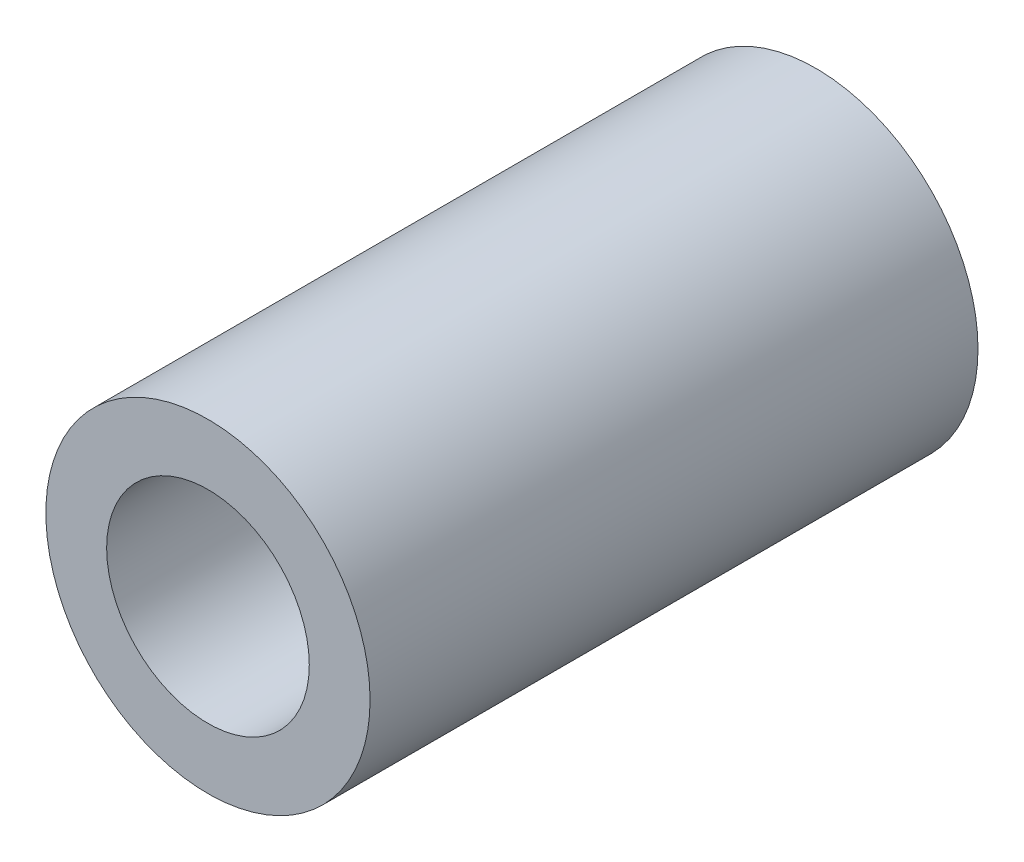
ISO-10303-21;
HEADER;
FILE_DESCRIPTION(('STEP AP214'),'2;1');
FILE_NAME('part.step','',(''),(''),'','','');
FILE_SCHEMA(('AUTOMOTIVE_DESIGN { 1 0 10303 214 1 1 1 1 }'));
ENDSEC;
DATA;
#1=APPLICATION_CONTEXT('core data for automotive mechanical design processes');
#2=APPLICATION_PROTOCOL_DEFINITION('international standard','automotive_design',2000,#1);
#3=PRODUCT_CONTEXT('',#1,'mechanical');
#4=PRODUCT('Part','Part','',(#3));
#5=PRODUCT_RELATED_PRODUCT_CATEGORY('part','',(#4));
#6=PRODUCT_DEFINITION_FORMATION('','',#4);
#7=PRODUCT_DEFINITION_CONTEXT('part definition',#1,'design');
#8=PRODUCT_DEFINITION('design','',#6,#7);
#9=PRODUCT_DEFINITION_SHAPE('','',#8);
#10=(LENGTH_UNIT() NAMED_UNIT(*) SI_UNIT(.MILLI.,.METRE.));
#11=(NAMED_UNIT(*) PLANE_ANGLE_UNIT() SI_UNIT($,.RADIAN.));
#12=(NAMED_UNIT(*) SI_UNIT($,.STERADIAN.) SOLID_ANGLE_UNIT());
#13=UNCERTAINTY_MEASURE_WITH_UNIT(LENGTH_MEASURE(1.E-05),#10,'distance_accuracy_value','');
#14=(GEOMETRIC_REPRESENTATION_CONTEXT(3) GLOBAL_UNCERTAINTY_ASSIGNED_CONTEXT((#13)) GLOBAL_UNIT_ASSIGNED_CONTEXT((#10,
#11,#12)) REPRESENTATION_CONTEXT('',''));
#15=CARTESIAN_POINT('',(0.,0.,0.));
#16=DIRECTION('',(0.,0.,1.));
#17=DIRECTION('',(1.,0.,0.));
#18=AXIS2_PLACEMENT_3D('',#15,#16,#17);
#19=CARTESIAN_POINT('',(0.,0.,6.));
#20=DIRECTION('',(0.,0.,1.));
#21=DIRECTION('',(1.,0.,0.));
#22=AXIS2_PLACEMENT_3D('',#19,#20,#21);
#23=PLANE('',#22);
#24=CARTESIAN_POINT('',(0.,0.,6.));
#25=DIRECTION('',(0.,0.,1.));
#26=DIRECTION('',(1.,0.,0.));
#27=AXIS2_PLACEMENT_3D('',#24,#25,#26);
#28=CIRCLE('',#27,1.6);
#29=CARTESIAN_POINT('',(1.6,0.,6.));
#30=VERTEX_POINT('',#29);
#31=EDGE_CURVE('E10',#30,#30,#28,.T.);
#32=ORIENTED_EDGE('',*,*,#31,.T.);
#33=EDGE_LOOP('',(#32));
#34=FACE_BOUND('',#33,.T.);
#35=CARTESIAN_POINT('',(0.,0.,6.));
#36=DIRECTION('',(0.,0.,1.));
#37=DIRECTION('',(1.,0.,0.));
#38=AXIS2_PLACEMENT_3D('',#35,#36,#37);
#39=CIRCLE('',#38,1.);
#40=CARTESIAN_POINT('',(1.,0.,6.));
#41=VERTEX_POINT('',#40);
#42=EDGE_CURVE('E44',#41,#41,#39,.T.);
#43=ORIENTED_EDGE('',*,*,#42,.F.);
#44=EDGE_LOOP('',(#43));
#45=FACE_BOUND('',#44,.T.);
#46=ADVANCED_FACE('F33',(#34,#45),#23,.T.);
#47=CARTESIAN_POINT('',(0.,0.,0.));
#48=DIRECTION('',(0.,0.,1.));
#49=DIRECTION('',(1.,0.,0.));
#50=AXIS2_PLACEMENT_3D('',#47,#48,#49);
#51=PLANE('',#50);
#52=CARTESIAN_POINT('',(0.,0.,0.));
#53=DIRECTION('',(0.,0.,1.));
#54=DIRECTION('',(1.,0.,0.));
#55=AXIS2_PLACEMENT_3D('',#52,#53,#54);
#56=CIRCLE('',#55,1.6);
#57=CARTESIAN_POINT('',(1.6,0.,0.));
#58=VERTEX_POINT('',#57);
#59=EDGE_CURVE('E37',#58,#58,#56,.T.);
#60=ORIENTED_EDGE('',*,*,#59,.F.);
#61=EDGE_LOOP('',(#60));
#62=FACE_BOUND('',#61,.T.);
#63=CARTESIAN_POINT('',(0.,0.,0.));
#64=DIRECTION('',(0.,0.,1.));
#65=DIRECTION('',(1.,0.,0.));
#66=AXIS2_PLACEMENT_3D('',#63,#64,#65);
#67=CIRCLE('',#66,1.);
#68=CARTESIAN_POINT('',(1.,0.,0.));
#69=VERTEX_POINT('',#68);
#70=EDGE_CURVE('E46',#69,#69,#67,.T.);
#71=ORIENTED_EDGE('',*,*,#70,.T.);
#72=EDGE_LOOP('',(#71));
#73=FACE_BOUND('',#72,.T.);
#74=ADVANCED_FACE('F56',(#62,#73),#51,.F.);
#75=CARTESIAN_POINT('',(0.,0.,6.));
#76=DIRECTION('',(0.,0.,-1.));
#77=DIRECTION('',(-1.,0.,0.));
#78=AXIS2_PLACEMENT_3D('',#75,#76,#77);
#79=CYLINDRICAL_SURFACE('',#78,1.6);
#80=ORIENTED_EDGE('',*,*,#31,.F.);
#81=EDGE_LOOP('',(#80));
#82=FACE_BOUND('',#81,.T.);
#83=ORIENTED_EDGE('',*,*,#59,.T.);
#84=EDGE_LOOP('',(#83));
#85=FACE_BOUND('',#84,.T.);
#86=ADVANCED_FACE('F35',(#82,#85),#79,.T.);
#87=CARTESIAN_POINT('',(0.,0.,6.));
#88=DIRECTION('',(0.,0.,-1.));
#89=DIRECTION('',(-1.,0.,0.));
#90=AXIS2_PLACEMENT_3D('',#87,#88,#89);
#91=CYLINDRICAL_SURFACE('',#90,1.);
#92=ORIENTED_EDGE('',*,*,#42,.T.);
#93=EDGE_LOOP('',(#92));
#94=FACE_BOUND('',#93,.T.);
#95=ORIENTED_EDGE('',*,*,#70,.F.);
#96=EDGE_LOOP('',(#95));
#97=FACE_BOUND('',#96,.T.);
#98=ADVANCED_FACE('F52',(#94,#97),#91,.F.);
#99=CLOSED_SHELL('',(#46,#74,#86,#98));
#100=MANIFOLD_SOLID_BREP('B2',#99);
#101=ADVANCED_BREP_SHAPE_REPRESENTATION('',(#18,#100),#14);
#102=SHAPE_DEFINITION_REPRESENTATION(#9,#101);
ENDSEC;
END-ISO-10303-21;
